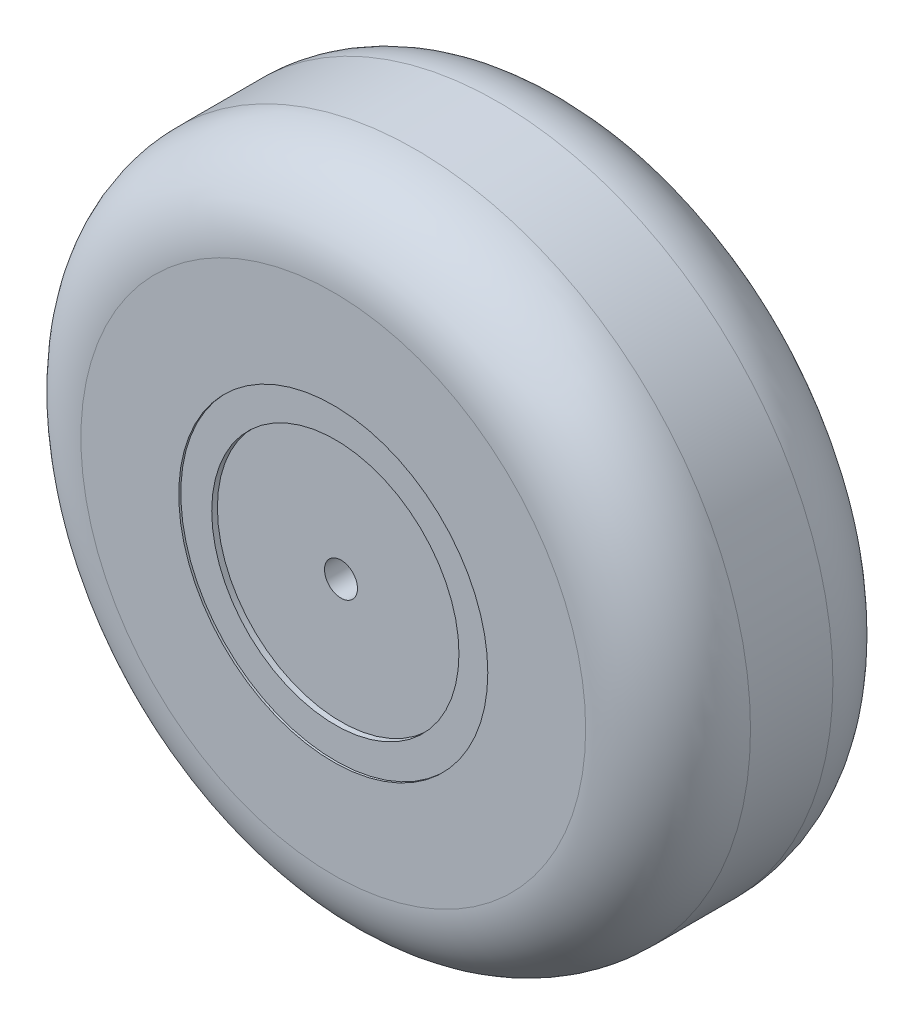
ISO-10303-21;
HEADER;
FILE_DESCRIPTION(('STEP AP214'),'2;1');
FILE_NAME('part.step','',(''),(''),'','','');
FILE_SCHEMA(('AUTOMOTIVE_DESIGN { 1 0 10303 214 1 1 1 1 }'));
ENDSEC;
DATA;
#1=APPLICATION_CONTEXT('core data for automotive mechanical design processes');
#2=APPLICATION_PROTOCOL_DEFINITION('international standard','automotive_design',2000,#1);
#3=PRODUCT_CONTEXT('',#1,'mechanical');
#4=PRODUCT('Part','Part','',(#3));
#5=PRODUCT_RELATED_PRODUCT_CATEGORY('part','',(#4));
#6=PRODUCT_DEFINITION_FORMATION('','',#4);
#7=PRODUCT_DEFINITION_CONTEXT('part definition',#1,'design');
#8=PRODUCT_DEFINITION('design','',#6,#7);
#9=PRODUCT_DEFINITION_SHAPE('','',#8);
#10=(LENGTH_UNIT() NAMED_UNIT(*) SI_UNIT(.MILLI.,.METRE.));
#11=(NAMED_UNIT(*) PLANE_ANGLE_UNIT() SI_UNIT($,.RADIAN.));
#12=(NAMED_UNIT(*) SI_UNIT($,.STERADIAN.) SOLID_ANGLE_UNIT());
#13=UNCERTAINTY_MEASURE_WITH_UNIT(LENGTH_MEASURE(1.E-05),#10,'distance_accuracy_value','');
#14=(GEOMETRIC_REPRESENTATION_CONTEXT(3) GLOBAL_UNCERTAINTY_ASSIGNED_CONTEXT((#13)) GLOBAL_UNIT_ASSIGNED_CONTEXT((#10,
#11,#12)) REPRESENTATION_CONTEXT('',''));
#15=CARTESIAN_POINT('',(0.,0.,0.));
#16=DIRECTION('',(0.,0.,1.));
#17=DIRECTION('',(1.,0.,0.));
#18=AXIS2_PLACEMENT_3D('',#15,#16,#17);
#19=CARTESIAN_POINT('',(0.,0.,23.71875));
#20=DIRECTION('',(0.,0.,-1.));
#21=DIRECTION('',(-1.,0.,0.));
#22=AXIS2_PLACEMENT_3D('',#19,#20,#21);
#23=CYLINDRICAL_SURFACE('',#22,2.8);
#24=CARTESIAN_POINT('',(0.,0.,23.71875));
#25=DIRECTION('',(0.,0.,1.));
#26=DIRECTION('',(1.,0.,0.));
#27=AXIS2_PLACEMENT_3D('',#24,#25,#26);
#28=CIRCLE('',#27,2.8);
#29=CARTESIAN_POINT('',(2.8,0.,23.71875));
#30=VERTEX_POINT('',#29);
#31=EDGE_CURVE('E57',#30,#30,#28,.T.);
#32=ORIENTED_EDGE('',*,*,#31,.F.);
#33=EDGE_LOOP('',(#32));
#34=FACE_BOUND('',#33,.T.);
#35=CARTESIAN_POINT('',(0.,0.,25.03125));
#36=DIRECTION('',(0.,0.,1.));
#37=DIRECTION('',(1.,0.,0.));
#38=AXIS2_PLACEMENT_3D('',#35,#36,#37);
#39=CIRCLE('',#38,2.8);
#40=CARTESIAN_POINT('',(2.8,0.,25.03125));
#41=VERTEX_POINT('',#40);
#42=EDGE_CURVE('E50',#41,#41,#39,.T.);
#43=ORIENTED_EDGE('',*,*,#42,.T.);
#44=EDGE_LOOP('',(#43));
#45=FACE_BOUND('',#44,.T.);
#46=ADVANCED_FACE('F47',(#34,#45),#23,.F.);
#47=CARTESIAN_POINT('',(0.,0.,25.03125));
#48=DIRECTION('',(0.,0.,1.));
#49=DIRECTION('',(1.,0.,0.));
#50=AXIS2_PLACEMENT_3D('',#47,#48,#49);
#51=PLANE('',#50);
#52=ORIENTED_EDGE('',*,*,#42,.F.);
#53=EDGE_LOOP('',(#52));
#54=FACE_BOUND('',#53,.T.);
#55=CARTESIAN_POINT('',(0.,0.,25.03125));
#56=DIRECTION('',(0.,0.,1.));
#57=DIRECTION('',(1.,0.,0.));
#58=AXIS2_PLACEMENT_3D('',#55,#56,#57);
#59=CIRCLE('',#58,8.75);
#60=CARTESIAN_POINT('',(8.75,0.,25.03125));
#61=VERTEX_POINT('',#60);
#62=EDGE_CURVE('E11',#61,#61,#59,.T.);
#63=ORIENTED_EDGE('',*,*,#62,.T.);
#64=EDGE_LOOP('',(#63));
#65=FACE_BOUND('',#64,.T.);
#66=ADVANCED_FACE('F74',(#54,#65),#51,.T.);
#67=CARTESIAN_POINT('',(0.,0.,25.03125));
#68=DIRECTION('',(0.,0.,-1.));
#69=DIRECTION('',(-1.,0.,0.));
#70=AXIS2_PLACEMENT_3D('',#67,#68,#69);
#71=CYLINDRICAL_SURFACE('',#70,8.75);
#72=ORIENTED_EDGE('',*,*,#62,.F.);
#73=EDGE_LOOP('',(#72));
#74=FACE_BOUND('',#73,.T.);
#75=CARTESIAN_POINT('',(0.,0.,23.71875));
#76=DIRECTION('',(0.,0.,1.));
#77=DIRECTION('',(1.,0.,0.));
#78=AXIS2_PLACEMENT_3D('',#75,#76,#77);
#79=CIRCLE('',#78,8.75);
#80=CARTESIAN_POINT('',(8.75,0.,23.71875));
#81=VERTEX_POINT('',#80);
#82=EDGE_CURVE('E61',#81,#81,#79,.T.);
#83=ORIENTED_EDGE('',*,*,#82,.T.);
#84=EDGE_LOOP('',(#83));
#85=FACE_BOUND('',#84,.T.);
#86=ADVANCED_FACE('F65',(#74,#85),#71,.T.);
#87=CARTESIAN_POINT('',(0.,0.,23.71875));
#88=DIRECTION('',(0.,0.,1.));
#89=DIRECTION('',(1.,0.,0.));
#90=AXIS2_PLACEMENT_3D('',#87,#88,#89);
#91=PLANE('',#90);
#92=ORIENTED_EDGE('',*,*,#31,.T.);
#93=EDGE_LOOP('',(#92));
#94=FACE_BOUND('',#93,.T.);
#95=ORIENTED_EDGE('',*,*,#82,.F.);
#96=EDGE_LOOP('',(#95));
#97=FACE_BOUND('',#96,.T.);
#98=ADVANCED_FACE('F67',(#94,#97),#91,.F.);
#99=CLOSED_SHELL('',(#46,#66,#86,#98));
#100=MANIFOLD_SOLID_BREP('B2',#99);
#101=CARTESIAN_POINT('',(0.,0.,32.9834816038992));
#102=DIRECTION('',(0.,0.,-1.));
#103=DIRECTION('',(-1.,0.,0.));
#104=AXIS2_PLACEMENT_3D('',#101,#102,#103);
#105=CYLINDRICAL_SURFACE('',#104,2.8);
#106=CARTESIAN_POINT('',(0.,0.,-7.70401839610081));
#107=DIRECTION('',(0.,0.,-1.));
#108=DIRECTION('',(-1.,0.,0.));
#109=AXIS2_PLACEMENT_3D('',#106,#107,#108);
#110=CIRCLE('',#109,2.8);
#111=CARTESIAN_POINT('',(-2.8,0.,-7.70401839610081));
#112=VERTEX_POINT('',#111);
#113=EDGE_CURVE('E140',#112,#112,#110,.T.);
#114=ORIENTED_EDGE('',*,*,#113,.T.);
#115=EDGE_LOOP('',(#114));
#116=FACE_BOUND('',#115,.T.);
#117=CARTESIAN_POINT('',(0.,0.,31.6709816038992));
#118=DIRECTION('',(0.,0.,1.));
#119=DIRECTION('',(1.,0.,0.));
#120=AXIS2_PLACEMENT_3D('',#117,#118,#119);
#121=CIRCLE('',#120,2.8);
#122=CARTESIAN_POINT('',(2.8,0.,31.6709816038992));
#123=VERTEX_POINT('',#122);
#124=EDGE_CURVE('E144',#123,#123,#121,.T.);
#125=ORIENTED_EDGE('',*,*,#124,.T.);
#126=EDGE_LOOP('',(#125));
#127=FACE_BOUND('',#126,.T.);
#128=ADVANCED_FACE('F120',(#116,#127),#105,.F.);
#129=CARTESIAN_POINT('',(0.,0.,32.9834816038992));
#130=DIRECTION('',(0.,0.,1.));
#131=DIRECTION('',(1.,0.,0.));
#132=AXIS2_PLACEMENT_3D('',#129,#130,#131);
#133=PLANE('',#132);
#134=CARTESIAN_POINT('',(0.,0.,32.9834816038992));
#135=DIRECTION('',(0.,0.,1.));
#136=DIRECTION('',(1.,0.,0.));
#137=AXIS2_PLACEMENT_3D('',#134,#135,#136);
#138=CIRCLE('',#137,26.25);
#139=CARTESIAN_POINT('',(26.25,0.,32.9834816038992));
#140=VERTEX_POINT('',#139);
#141=EDGE_CURVE('E137',#140,#140,#138,.T.);
#142=ORIENTED_EDGE('',*,*,#141,.F.);
#143=EDGE_LOOP('',(#142));
#144=FACE_BOUND('',#143,.T.);
#145=CARTESIAN_POINT('',(0.,0.,32.9834816038992));
#146=DIRECTION('',(0.,0.,1.));
#147=DIRECTION('',(1.,0.,0.));
#148=AXIS2_PLACEMENT_3D('',#145,#146,#147);
#149=CIRCLE('',#148,42.875);
#150=CARTESIAN_POINT('',(42.875,0.,32.9834816038992));
#151=VERTEX_POINT('',#150);
#152=EDGE_CURVE('E146',#151,#151,#149,.T.);
#153=ORIENTED_EDGE('',*,*,#152,.T.);
#154=EDGE_LOOP('',(#153));
#155=FACE_BOUND('',#154,.T.);
#156=ADVANCED_FACE('F189',(#144,#155),#133,.T.);
#157=CARTESIAN_POINT('',(0.,0.,-9.01651839610082));
#158=DIRECTION('',(0.,0.,1.));
#159=DIRECTION('',(1.,0.,0.));
#160=AXIS2_PLACEMENT_3D('',#157,#158,#159);
#161=PLANE('',#160);
#162=CARTESIAN_POINT('',(0.,0.,-9.01651839610082));
#163=DIRECTION('',(0.,0.,-1.));
#164=DIRECTION('',(-1.,0.,0.));
#165=AXIS2_PLACEMENT_3D('',#162,#163,#164);
#166=CIRCLE('',#165,26.25);
#167=CARTESIAN_POINT('',(-26.25,0.,-9.01651839610082));
#168=VERTEX_POINT('',#167);
#169=EDGE_CURVE('E168',#168,#168,#166,.T.);
#170=ORIENTED_EDGE('',*,*,#169,.F.);
#171=EDGE_LOOP('',(#170));
#172=FACE_BOUND('',#171,.T.);
#173=CARTESIAN_POINT('',(0.,0.,-9.01651839610082));
#174=DIRECTION('',(0.,0.,1.));
#175=DIRECTION('',(1.,0.,0.));
#176=AXIS2_PLACEMENT_3D('',#173,#174,#175);
#177=CIRCLE('',#176,42.875);
#178=CARTESIAN_POINT('',(42.875,0.,-9.01651839610082));
#179=VERTEX_POINT('',#178);
#180=EDGE_CURVE('E150',#179,#179,#177,.F.);
#181=ORIENTED_EDGE('',*,*,#180,.T.);
#182=EDGE_LOOP('',(#181));
#183=FACE_BOUND('',#182,.T.);
#184=ADVANCED_FACE('F185',(#172,#183),#161,.F.);
#185=CARTESIAN_POINT('',(0.,0.,32.9834816038992));
#186=DIRECTION('',(0.,0.,-1.));
#187=DIRECTION('',(-1.,0.,0.));
#188=AXIS2_PLACEMENT_3D('',#185,#186,#187);
#189=CYLINDRICAL_SURFACE('',#188,56.875);
#190=CARTESIAN_POINT('',(0.,0.,4.98348160389918));
#191=DIRECTION('',(0.,0.,1.));
#192=DIRECTION('',(1.,0.,0.));
#193=AXIS2_PLACEMENT_3D('',#190,#191,#192);
#194=CIRCLE('',#193,56.875);
#195=CARTESIAN_POINT('',(56.875,0.,4.98348160389918));
#196=VERTEX_POINT('',#195);
#197=EDGE_CURVE('E154',#196,#196,#194,.T.);
#198=ORIENTED_EDGE('',*,*,#197,.T.);
#199=EDGE_LOOP('',(#198));
#200=FACE_BOUND('',#199,.T.);
#201=CARTESIAN_POINT('',(0.,0.,18.9834816038992));
#202=DIRECTION('',(0.,0.,1.));
#203=DIRECTION('',(1.,0.,0.));
#204=AXIS2_PLACEMENT_3D('',#201,#202,#203);
#205=CIRCLE('',#204,56.875);
#206=CARTESIAN_POINT('',(56.875,0.,18.9834816038992));
#207=VERTEX_POINT('',#206);
#208=EDGE_CURVE('E158',#207,#207,#205,.F.);
#209=ORIENTED_EDGE('',*,*,#208,.T.);
#210=EDGE_LOOP('',(#209));
#211=FACE_BOUND('',#210,.T.);
#212=ADVANCED_FACE('F188',(#200,#211),#189,.T.);
#213=CARTESIAN_POINT('',(0.,0.,4.98348160389918));
#214=DIRECTION('',(0.,0.,1.));
#215=DIRECTION('',(1.,0.,0.));
#216=AXIS2_PLACEMENT_3D('',#213,#214,#215);
#217=TOROIDAL_SURFACE('',#216,42.875,14.);
#218=ORIENTED_EDGE('',*,*,#180,.F.);
#219=EDGE_LOOP('',(#218));
#220=FACE_BOUND('',#219,.T.);
#221=ORIENTED_EDGE('',*,*,#197,.F.);
#222=EDGE_LOOP('',(#221));
#223=FACE_BOUND('',#222,.T.);
#224=ADVANCED_FACE('F193',(#220,#223),#217,.T.);
#225=CARTESIAN_POINT('',(0.,0.,18.9834816038992));
#226=DIRECTION('',(0.,0.,1.));
#227=DIRECTION('',(1.,0.,0.));
#228=AXIS2_PLACEMENT_3D('',#225,#226,#227);
#229=TOROIDAL_SURFACE('',#228,42.875,14.);
#230=ORIENTED_EDGE('',*,*,#208,.F.);
#231=EDGE_LOOP('',(#230));
#232=FACE_BOUND('',#231,.T.);
#233=ORIENTED_EDGE('',*,*,#152,.F.);
#234=EDGE_LOOP('',(#233));
#235=FACE_BOUND('',#234,.T.);
#236=ADVANCED_FACE('F196',(#232,#235),#229,.T.);
#237=CARTESIAN_POINT('',(0.,0.,32.6334816038992));
#238=DIRECTION('',(0.,0.,1.));
#239=DIRECTION('',(1.,0.,0.));
#240=AXIS2_PLACEMENT_3D('',#237,#238,#239);
#241=CYLINDRICAL_SURFACE('',#240,26.25);
#242=CARTESIAN_POINT('',(0.,0.,32.6334816038992));
#243=DIRECTION('',(0.,0.,1.));
#244=DIRECTION('',(1.,0.,0.));
#245=AXIS2_PLACEMENT_3D('',#242,#243,#244);
#246=CIRCLE('',#245,26.25);
#247=CARTESIAN_POINT('',(26.25,0.,32.6334816038992));
#248=VERTEX_POINT('',#247);
#249=EDGE_CURVE('E132',#248,#248,#246,.T.);
#250=ORIENTED_EDGE('',*,*,#249,.F.);
#251=EDGE_LOOP('',(#250));
#252=FACE_BOUND('',#251,.T.);
#253=ORIENTED_EDGE('',*,*,#141,.T.);
#254=EDGE_LOOP('',(#253));
#255=FACE_BOUND('',#254,.T.);
#256=ADVANCED_FACE('F207',(#252,#255),#241,.F.);
#257=CARTESIAN_POINT('',(0.,0.,32.6334816038992));
#258=DIRECTION('',(0.,0.,1.));
#259=DIRECTION('',(1.,0.,0.));
#260=AXIS2_PLACEMENT_3D('',#257,#258,#259);
#261=PLANE('',#260);
#262=CARTESIAN_POINT('',(0.,0.,32.6334816038992));
#263=DIRECTION('',(0.,0.,1.));
#264=DIRECTION('',(1.,0.,0.));
#265=AXIS2_PLACEMENT_3D('',#262,#263,#264);
#266=CIRCLE('',#265,21.);
#267=CARTESIAN_POINT('',(21.,0.,32.6334816038992));
#268=VERTEX_POINT('',#267);
#269=EDGE_CURVE('E127',#268,#268,#266,.T.);
#270=ORIENTED_EDGE('',*,*,#269,.F.);
#271=EDGE_LOOP('',(#270));
#272=FACE_BOUND('',#271,.T.);
#273=ORIENTED_EDGE('',*,*,#249,.T.);
#274=EDGE_LOOP('',(#273));
#275=FACE_BOUND('',#274,.T.);
#276=ADVANCED_FACE('F236',(#272,#275),#261,.T.);
#277=CARTESIAN_POINT('',(0.,0.,-7.70401839610082));
#278=DIRECTION('',(0.,0.,-1.));
#279=DIRECTION('',(-1.,0.,0.));
#280=AXIS2_PLACEMENT_3D('',#277,#278,#279);
#281=PLANE('',#280);
#282=ORIENTED_EDGE('',*,*,#113,.F.);
#283=EDGE_LOOP('',(#282));
#284=FACE_BOUND('',#283,.T.);
#285=CARTESIAN_POINT('',(0.,0.,-7.70401839610082));
#286=DIRECTION('',(0.,0.,-1.));
#287=DIRECTION('',(-1.,0.,0.));
#288=AXIS2_PLACEMENT_3D('',#285,#286,#287);
#289=CIRCLE('',#288,26.25);
#290=CARTESIAN_POINT('',(-26.25,0.,-7.70401839610082));
#291=VERTEX_POINT('',#290);
#292=EDGE_CURVE('E145',#291,#291,#289,.T.);
#293=ORIENTED_EDGE('',*,*,#292,.T.);
#294=EDGE_LOOP('',(#293));
#295=FACE_BOUND('',#294,.T.);
#296=ADVANCED_FACE('F176',(#284,#295),#281,.T.);
#297=CARTESIAN_POINT('',(0.,0.,31.6709816038992));
#298=DIRECTION('',(0.,0.,1.));
#299=DIRECTION('',(1.,0.,0.));
#300=AXIS2_PLACEMENT_3D('',#297,#298,#299);
#301=CYLINDRICAL_SURFACE('',#300,21.);
#302=ORIENTED_EDGE('',*,*,#269,.T.);
#303=EDGE_LOOP('',(#302));
#304=FACE_BOUND('',#303,.T.);
#305=CARTESIAN_POINT('',(0.,0.,31.6709816038992));
#306=DIRECTION('',(0.,0.,1.));
#307=DIRECTION('',(1.,0.,0.));
#308=AXIS2_PLACEMENT_3D('',#305,#306,#307);
#309=CIRCLE('',#308,21.);
#310=CARTESIAN_POINT('',(21.,0.,31.6709816038992));
#311=VERTEX_POINT('',#310);
#312=EDGE_CURVE('E46',#311,#311,#309,.T.);
#313=ORIENTED_EDGE('',*,*,#312,.F.);
#314=EDGE_LOOP('',(#313));
#315=FACE_BOUND('',#314,.T.);
#316=ADVANCED_FACE('F223',(#304,#315),#301,.F.);
#317=CARTESIAN_POINT('',(0.,0.,31.6709816038992));
#318=DIRECTION('',(0.,0.,1.));
#319=DIRECTION('',(1.,0.,0.));
#320=AXIS2_PLACEMENT_3D('',#317,#318,#319);
#321=PLANE('',#320);
#322=ORIENTED_EDGE('',*,*,#124,.F.);
#323=EDGE_LOOP('',(#322));
#324=FACE_BOUND('',#323,.T.);
#325=ORIENTED_EDGE('',*,*,#312,.T.);
#326=EDGE_LOOP('',(#325));
#327=FACE_BOUND('',#326,.T.);
#328=ADVANCED_FACE('F181',(#324,#327),#321,.T.);
#329=CARTESIAN_POINT('',(0.,0.,-7.70401839610082));
#330=DIRECTION('',(0.,0.,-1.));
#331=DIRECTION('',(-1.,0.,0.));
#332=AXIS2_PLACEMENT_3D('',#329,#330,#331);
#333=CYLINDRICAL_SURFACE('',#332,26.25);
#334=ORIENTED_EDGE('',*,*,#292,.F.);
#335=EDGE_LOOP('',(#334));
#336=FACE_BOUND('',#335,.T.);
#337=ORIENTED_EDGE('',*,*,#169,.T.);
#338=EDGE_LOOP('',(#337));
#339=FACE_BOUND('',#338,.T.);
#340=ADVANCED_FACE('F178',(#336,#339),#333,.F.);
#341=CLOSED_SHELL('',(#128,#156,#184,#212,#224,#236,#256,#276,#296,#316,#328,#340));
#342=MANIFOLD_SOLID_BREP('B6',#341);
#343=CARTESIAN_POINT('',(0.,0.,-1.03125));
#344=DIRECTION('',(0.,0.,1.));
#345=DIRECTION('',(1.,0.,0.));
#346=AXIS2_PLACEMENT_3D('',#343,#344,#345);
#347=CYLINDRICAL_SURFACE('',#346,8.75);
#348=CARTESIAN_POINT('',(0.,0.,-1.03125));
#349=DIRECTION('',(0.,0.,-1.));
#350=DIRECTION('',(-1.,0.,0.));
#351=AXIS2_PLACEMENT_3D('',#348,#349,#350);
#352=CIRCLE('',#351,8.75);
#353=CARTESIAN_POINT('',(-8.75,0.,-1.03125));
#354=VERTEX_POINT('',#353);
#355=EDGE_CURVE('E119',#354,#354,#352,.T.);
#356=ORIENTED_EDGE('',*,*,#355,.F.);
#357=EDGE_LOOP('',(#356));
#358=FACE_BOUND('',#357,.T.);
#359=CARTESIAN_POINT('',(0.,0.,0.281250000000001));
#360=DIRECTION('',(0.,0.,-1.));
#361=DIRECTION('',(-1.,0.,0.));
#362=AXIS2_PLACEMENT_3D('',#359,#360,#361);
#363=CIRCLE('',#362,8.75);
#364=CARTESIAN_POINT('',(-8.75,0.,0.281250000000001));
#365=VERTEX_POINT('',#364);
#366=EDGE_CURVE('E347',#365,#365,#363,.T.);
#367=ORIENTED_EDGE('',*,*,#366,.T.);
#368=EDGE_LOOP('',(#367));
#369=FACE_BOUND('',#368,.T.);
#370=ADVANCED_FACE('F335',(#358,#369),#347,.T.);
#371=CARTESIAN_POINT('',(0.,0.,-1.03125));
#372=DIRECTION('',(0.,0.,-1.));
#373=DIRECTION('',(-1.,0.,0.));
#374=AXIS2_PLACEMENT_3D('',#371,#372,#373);
#375=PLANE('',#374);
#376=CARTESIAN_POINT('',(0.,0.,-1.03125));
#377=DIRECTION('',(0.,0.,-1.));
#378=DIRECTION('',(-1.,0.,0.));
#379=AXIS2_PLACEMENT_3D('',#376,#377,#378);
#380=CIRCLE('',#379,2.8);
#381=CARTESIAN_POINT('',(-2.8,0.,-1.03125));
#382=VERTEX_POINT('',#381);
#383=EDGE_CURVE('E343',#382,#382,#380,.T.);
#384=ORIENTED_EDGE('',*,*,#383,.F.);
#385=EDGE_LOOP('',(#384));
#386=FACE_BOUND('',#385,.T.);
#387=ORIENTED_EDGE('',*,*,#355,.T.);
#388=EDGE_LOOP('',(#387));
#389=FACE_BOUND('',#388,.T.);
#390=ADVANCED_FACE('F361',(#386,#389),#375,.T.);
#391=CARTESIAN_POINT('',(0.,0.,42.28125));
#392=DIRECTION('',(0.,0.,-1.));
#393=DIRECTION('',(-1.,0.,0.));
#394=AXIS2_PLACEMENT_3D('',#391,#392,#393);
#395=CYLINDRICAL_SURFACE('',#394,2.8);
#396=CARTESIAN_POINT('',(0.,0.,0.281250000000001));
#397=DIRECTION('',(0.,0.,-1.));
#398=DIRECTION('',(-1.,0.,0.));
#399=AXIS2_PLACEMENT_3D('',#396,#397,#398);
#400=CIRCLE('',#399,2.8);
#401=CARTESIAN_POINT('',(-2.8,0.,0.281250000000001));
#402=VERTEX_POINT('',#401);
#403=EDGE_CURVE('E339',#402,#402,#400,.T.);
#404=ORIENTED_EDGE('',*,*,#403,.F.);
#405=EDGE_LOOP('',(#404));
#406=FACE_BOUND('',#405,.T.);
#407=ORIENTED_EDGE('',*,*,#383,.T.);
#408=EDGE_LOOP('',(#407));
#409=FACE_BOUND('',#408,.T.);
#410=ADVANCED_FACE('F337',(#406,#409),#395,.F.);
#411=CARTESIAN_POINT('',(0.,0.,0.281250000000001));
#412=DIRECTION('',(0.,0.,-1.));
#413=DIRECTION('',(-1.,0.,0.));
#414=AXIS2_PLACEMENT_3D('',#411,#412,#413);
#415=PLANE('',#414);
#416=ORIENTED_EDGE('',*,*,#403,.T.);
#417=EDGE_LOOP('',(#416));
#418=FACE_BOUND('',#417,.T.);
#419=ORIENTED_EDGE('',*,*,#366,.F.);
#420=EDGE_LOOP('',(#419));
#421=FACE_BOUND('',#420,.T.);
#422=ADVANCED_FACE('F356',(#418,#421),#415,.F.);
#423=CLOSED_SHELL('',(#370,#390,#410,#422));
#424=MANIFOLD_SOLID_BREP('B41',#423);
#425=ADVANCED_BREP_SHAPE_REPRESENTATION('',(#18,#100,#342,#424),#14);
#426=SHAPE_DEFINITION_REPRESENTATION(#9,#425);
ENDSEC;
END-ISO-10303-21;
